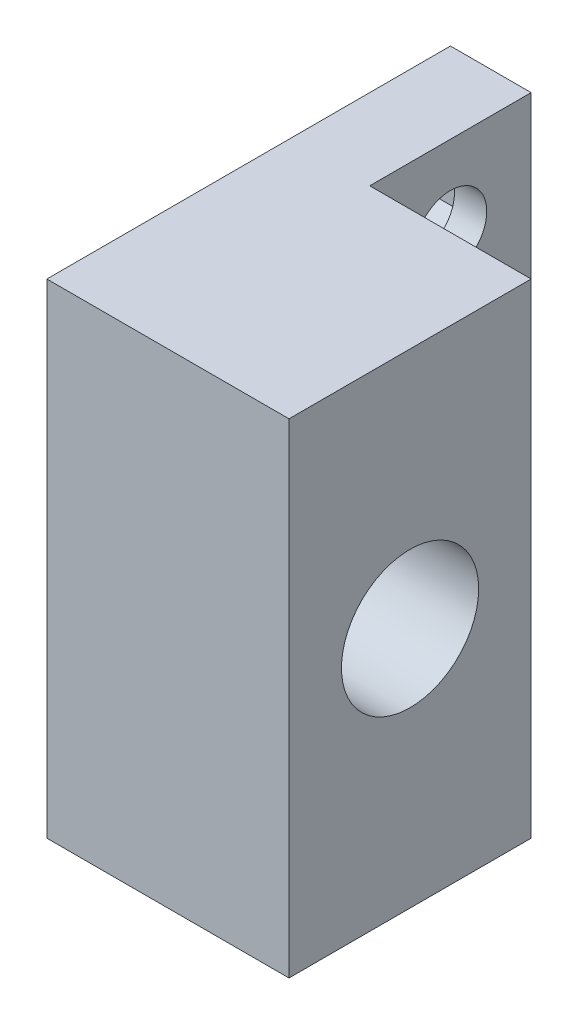
ISO-10303-21;
HEADER;
FILE_DESCRIPTION(('STEP AP214'),'2;1');
FILE_NAME('part.step','',(''),(''),'','','');
FILE_SCHEMA(('AUTOMOTIVE_DESIGN { 1 0 10303 214 1 1 1 1 }'));
ENDSEC;
DATA;
#1=APPLICATION_CONTEXT('core data for automotive mechanical design processes');
#2=APPLICATION_PROTOCOL_DEFINITION('international standard','automotive_design',2000,#1);
#3=PRODUCT_CONTEXT('',#1,'mechanical');
#4=PRODUCT('Part','Part','',(#3));
#5=PRODUCT_RELATED_PRODUCT_CATEGORY('part','',(#4));
#6=PRODUCT_DEFINITION_FORMATION('','',#4);
#7=PRODUCT_DEFINITION_CONTEXT('part definition',#1,'design');
#8=PRODUCT_DEFINITION('design','',#6,#7);
#9=PRODUCT_DEFINITION_SHAPE('','',#8);
#10=(LENGTH_UNIT() NAMED_UNIT(*) SI_UNIT(.MILLI.,.METRE.));
#11=(NAMED_UNIT(*) PLANE_ANGLE_UNIT() SI_UNIT($,.RADIAN.));
#12=(NAMED_UNIT(*) SI_UNIT($,.STERADIAN.) SOLID_ANGLE_UNIT());
#13=UNCERTAINTY_MEASURE_WITH_UNIT(LENGTH_MEASURE(1.E-05),#10,'distance_accuracy_value','');
#14=(GEOMETRIC_REPRESENTATION_CONTEXT(3) GLOBAL_UNCERTAINTY_ASSIGNED_CONTEXT((#13)) GLOBAL_UNIT_ASSIGNED_CONTEXT((#10,
#11,#12)) REPRESENTATION_CONTEXT('',''));
#15=CARTESIAN_POINT('',(0.,0.,0.));
#16=DIRECTION('',(0.,0.,1.));
#17=DIRECTION('',(1.,0.,0.));
#18=AXIS2_PLACEMENT_3D('',#15,#16,#17);
#19=CARTESIAN_POINT('',(-10.,5.,-20.));
#20=DIRECTION('',(1.,0.,0.));
#21=DIRECTION('',(0.,0.,-1.));
#22=AXIS2_PLACEMENT_3D('',#19,#20,#21);
#23=CYLINDRICAL_SURFACE('',#22,2.25);
#24=CARTESIAN_POINT('',(5.,5.,-20.));
#25=DIRECTION('',(1.,0.,0.));
#26=DIRECTION('',(0.,0.,-1.));
#27=AXIS2_PLACEMENT_3D('',#24,#25,#26);
#28=CIRCLE('',#27,2.25);
#29=CARTESIAN_POINT('',(5.,5.,-22.25));
#30=VERTEX_POINT('',#29);
#31=EDGE_CURVE('E286',#30,#30,#28,.T.);
#32=ORIENTED_EDGE('',*,*,#31,.T.);
#33=EDGE_LOOP('',(#32));
#34=FACE_BOUND('',#33,.T.);
#35=CARTESIAN_POINT('',(3.,5.,-20.));
#36=DIRECTION('',(-1.,0.,0.));
#37=DIRECTION('',(0.,0.,1.));
#38=AXIS2_PLACEMENT_3D('',#35,#36,#37);
#39=CIRCLE('',#38,2.25);
#40=CARTESIAN_POINT('',(3.,5.,-17.75));
#41=VERTEX_POINT('',#40);
#42=EDGE_CURVE('E36',#41,#41,#39,.F.);
#43=ORIENTED_EDGE('',*,*,#42,.F.);
#44=EDGE_LOOP('',(#43));
#45=FACE_BOUND('',#44,.T.);
#46=ADVANCED_FACE('F32',(#34,#45),#23,.F.);
#47=CARTESIAN_POINT('',(-10.,25.,-20.));
#48=DIRECTION('',(1.,0.,0.));
#49=DIRECTION('',(0.,0.,-1.));
#50=AXIS2_PLACEMENT_3D('',#47,#48,#49);
#51=CYLINDRICAL_SURFACE('',#50,2.25);
#52=CARTESIAN_POINT('',(5.,25.,-20.));
#53=DIRECTION('',(1.,0.,0.));
#54=DIRECTION('',(0.,0.,-1.));
#55=AXIS2_PLACEMENT_3D('',#52,#53,#54);
#56=CIRCLE('',#55,2.25);
#57=CARTESIAN_POINT('',(5.,25.,-22.25));
#58=VERTEX_POINT('',#57);
#59=EDGE_CURVE('E289',#58,#58,#56,.T.);
#60=ORIENTED_EDGE('',*,*,#59,.T.);
#61=EDGE_LOOP('',(#60));
#62=FACE_BOUND('',#61,.T.);
#63=CARTESIAN_POINT('',(3.,25.,-20.));
#64=DIRECTION('',(-1.,0.,0.));
#65=DIRECTION('',(0.,0.,1.));
#66=AXIS2_PLACEMENT_3D('',#63,#64,#65);
#67=CIRCLE('',#66,2.25);
#68=CARTESIAN_POINT('',(3.,25.,-17.75));
#69=VERTEX_POINT('',#68);
#70=EDGE_CURVE('E276',#69,#69,#67,.F.);
#71=ORIENTED_EDGE('',*,*,#70,.F.);
#72=EDGE_LOOP('',(#71));
#73=FACE_BOUND('',#72,.T.);
#74=ADVANCED_FACE('F370',(#62,#73),#51,.F.);
#75=CARTESIAN_POINT('',(5.,0.,0.));
#76=DIRECTION('',(1.,0.,0.));
#77=DIRECTION('',(0.,0.,-1.));
#78=AXIS2_PLACEMENT_3D('',#75,#76,#77);
#79=PLANE('',#78);
#80=ORIENTED_EDGE('',*,*,#31,.F.);
#81=EDGE_LOOP('',(#80));
#82=FACE_BOUND('',#81,.T.);
#83=DIRECTION('',(0.,1.,0.));
#84=VECTOR('',#83,1.);
#85=CARTESIAN_POINT('',(5.,30.,-15.));
#86=LINE('',#85,#84);
#87=CARTESIAN_POINT('',(5.,0.,-15.));
#88=VERTEX_POINT('',#87);
#89=CARTESIAN_POINT('',(5.,10.,-15.));
#90=VERTEX_POINT('',#89);
#91=EDGE_CURVE('E43',#88,#90,#86,.T.);
#92=ORIENTED_EDGE('',*,*,#91,.F.);
#93=DIRECTION('',(0.,0.,-1.));
#94=VECTOR('',#93,1.);
#95=CARTESIAN_POINT('',(5.,0.,0.));
#96=LINE('',#95,#94);
#97=CARTESIAN_POINT('',(5.,0.,-25.));
#98=VERTEX_POINT('',#97);
#99=EDGE_CURVE('E325',#88,#98,#96,.T.);
#100=ORIENTED_EDGE('',*,*,#99,.T.);
#101=DIRECTION('',(0.,1.,0.));
#102=VECTOR('',#101,1.);
#103=CARTESIAN_POINT('',(5.,0.,-25.));
#104=LINE('',#103,#102);
#105=CARTESIAN_POINT('',(5.,10.,-25.));
#106=VERTEX_POINT('',#105);
#107=EDGE_CURVE('E323',#98,#106,#104,.T.);
#108=ORIENTED_EDGE('',*,*,#107,.T.);
#109=DIRECTION('',(0.,0.,1.));
#110=VECTOR('',#109,1.);
#111=CARTESIAN_POINT('',(5.,9.99999999999999,0.));
#112=LINE('',#111,#110);
#113=EDGE_CURVE('E327',#106,#90,#112,.T.);
#114=ORIENTED_EDGE('',*,*,#113,.T.);
#115=EDGE_LOOP('',(#92,#100,#108,#114));
#116=FACE_BOUND('',#115,.T.);
#117=ADVANCED_FACE('F372',(#82,#116),#79,.T.);
#118=CARTESIAN_POINT('',(5.,0.,-15.));
#119=DIRECTION('',(0.,0.,1.));
#120=DIRECTION('',(1.,0.,0.));
#121=AXIS2_PLACEMENT_3D('',#118,#119,#120);
#122=PLANE('',#121);
#123=DIRECTION('',(0.,1.,0.));
#124=VECTOR('',#123,1.);
#125=CARTESIAN_POINT('',(0.,0.,-15.));
#126=LINE('',#125,#124);
#127=CARTESIAN_POINT('',(0.,10.,-15.));
#128=VERTEX_POINT('',#127);
#129=CARTESIAN_POINT('',(0.,20.,-15.));
#130=VERTEX_POINT('',#129);
#131=EDGE_CURVE('E315',#128,#130,#126,.T.);
#132=ORIENTED_EDGE('',*,*,#131,.T.);
#133=DIRECTION('',(-1.,0.,0.));
#134=VECTOR('',#133,1.);
#135=CARTESIAN_POINT('',(5.,20.,-15.));
#136=LINE('',#135,#134);
#137=CARTESIAN_POINT('',(5.,20.,-15.));
#138=VERTEX_POINT('',#137);
#139=EDGE_CURVE('E41',#138,#130,#136,.T.);
#140=ORIENTED_EDGE('',*,*,#139,.F.);
#141=CARTESIAN_POINT('',(5.,30.,-15.));
#142=VERTEX_POINT('',#141);
#143=EDGE_CURVE('E11',#138,#142,#86,.T.);
#144=ORIENTED_EDGE('',*,*,#143,.T.);
#145=DIRECTION('',(-1.,0.,0.));
#146=VECTOR('',#145,1.);
#147=CARTESIAN_POINT('',(15.,30.,-15.));
#148=LINE('',#147,#146);
#149=CARTESIAN_POINT('',(15.,30.,-15.));
#150=VERTEX_POINT('',#149);
#151=EDGE_CURVE('E307',#150,#142,#148,.T.);
#152=ORIENTED_EDGE('',*,*,#151,.F.);
#153=DIRECTION('',(0.,1.,0.));
#154=VECTOR('',#153,1.);
#155=CARTESIAN_POINT('',(15.,30.,-15.));
#156=LINE('',#155,#154);
#157=CARTESIAN_POINT('',(15.,0.,-15.));
#158=VERTEX_POINT('',#157);
#159=EDGE_CURVE('E303',#158,#150,#156,.T.);
#160=ORIENTED_EDGE('',*,*,#159,.F.);
#161=DIRECTION('',(-1.,0.,0.));
#162=VECTOR('',#161,1.);
#163=CARTESIAN_POINT('',(15.,0.,-15.));
#164=LINE('',#163,#162);
#165=EDGE_CURVE('E312',#158,#88,#164,.T.);
#166=ORIENTED_EDGE('',*,*,#165,.T.);
#167=ORIENTED_EDGE('',*,*,#91,.T.);
#168=DIRECTION('',(-1.,0.,0.));
#169=VECTOR('',#168,1.);
#170=CARTESIAN_POINT('',(5.,10.,-15.));
#171=LINE('',#170,#169);
#172=EDGE_CURVE('E329',#90,#128,#171,.T.);
#173=ORIENTED_EDGE('',*,*,#172,.T.);
#174=EDGE_LOOP('',(#132,#140,#144,#152,#160,#166,#167,#173));
#175=FACE_BOUND('',#174,.T.);
#176=ADVANCED_FACE('F34',(#175),#122,.F.);
#177=CARTESIAN_POINT('',(5.,20.,0.));
#178=DIRECTION('',(0.,1.,0.));
#179=DIRECTION('',(0.,0.,1.));
#180=AXIS2_PLACEMENT_3D('',#177,#178,#179);
#181=PLANE('',#180);
#182=DIRECTION('',(0.,0.,-1.));
#183=VECTOR('',#182,1.);
#184=CARTESIAN_POINT('',(0.,20.,0.));
#185=LINE('',#184,#183);
#186=CARTESIAN_POINT('',(0.,20.,-25.));
#187=VERTEX_POINT('',#186);
#188=EDGE_CURVE('E332',#130,#187,#185,.T.);
#189=ORIENTED_EDGE('',*,*,#188,.T.);
#190=DIRECTION('',(-1.,0.,0.));
#191=VECTOR('',#190,1.);
#192=CARTESIAN_POINT('',(5.,20.,-25.));
#193=LINE('',#192,#191);
#194=CARTESIAN_POINT('',(5.,20.,-25.));
#195=VERTEX_POINT('',#194);
#196=EDGE_CURVE('E361',#195,#187,#193,.T.);
#197=ORIENTED_EDGE('',*,*,#196,.F.);
#198=DIRECTION('',(0.,0.,-1.));
#199=VECTOR('',#198,1.);
#200=CARTESIAN_POINT('',(5.,20.,0.));
#201=LINE('',#200,#199);
#202=EDGE_CURVE('E316',#138,#195,#201,.T.);
#203=ORIENTED_EDGE('',*,*,#202,.F.);
#204=ORIENTED_EDGE('',*,*,#139,.T.);
#205=EDGE_LOOP('',(#189,#197,#203,#204));
#206=FACE_BOUND('',#205,.T.);
#207=ADVANCED_FACE('F420',(#206),#181,.F.);
#208=CARTESIAN_POINT('',(5.,0.,-25.));
#209=DIRECTION('',(0.,0.,1.));
#210=DIRECTION('',(1.,0.,0.));
#211=AXIS2_PLACEMENT_3D('',#208,#209,#210);
#212=PLANE('',#211);
#213=DIRECTION('',(0.,1.,0.));
#214=VECTOR('',#213,1.);
#215=CARTESIAN_POINT('',(0.,0.,-25.));
#216=LINE('',#215,#214);
#217=CARTESIAN_POINT('',(0.,30.,-25.));
#218=VERTEX_POINT('',#217);
#219=EDGE_CURVE('E334',#187,#218,#216,.T.);
#220=ORIENTED_EDGE('',*,*,#219,.T.);
#221=DIRECTION('',(-1.,0.,0.));
#222=VECTOR('',#221,1.);
#223=CARTESIAN_POINT('',(5.,30.,-25.));
#224=LINE('',#223,#222);
#225=CARTESIAN_POINT('',(5.,30.,-25.));
#226=VERTEX_POINT('',#225);
#227=EDGE_CURVE('E359',#226,#218,#224,.T.);
#228=ORIENTED_EDGE('',*,*,#227,.F.);
#229=EDGE_CURVE('E318',#195,#226,#104,.T.);
#230=ORIENTED_EDGE('',*,*,#229,.F.);
#231=ORIENTED_EDGE('',*,*,#196,.T.);
#232=EDGE_LOOP('',(#220,#228,#230,#231));
#233=FACE_BOUND('',#232,.T.);
#234=ADVANCED_FACE('F409',(#233),#212,.F.);
#235=CARTESIAN_POINT('',(5.,30.,0.));
#236=DIRECTION('',(0.,1.,0.));
#237=DIRECTION('',(0.,0.,1.));
#238=AXIS2_PLACEMENT_3D('',#235,#236,#237);
#239=PLANE('',#238);
#240=DIRECTION('',(0.,0.,-1.));
#241=VECTOR('',#240,1.);
#242=CARTESIAN_POINT('',(0.,30.,0.));
#243=LINE('',#242,#241);
#244=CARTESIAN_POINT('',(0.,30.,0.));
#245=VERTEX_POINT('',#244);
#246=EDGE_CURVE('E337',#245,#218,#243,.T.);
#247=ORIENTED_EDGE('',*,*,#246,.F.);
#248=DIRECTION('',(-1.,0.,0.));
#249=VECTOR('',#248,1.);
#250=CARTESIAN_POINT('',(5.,30.,0.));
#251=LINE('',#250,#249);
#252=CARTESIAN_POINT('',(15.,30.,0.));
#253=VERTEX_POINT('',#252);
#254=EDGE_CURVE('E357',#253,#245,#251,.T.);
#255=ORIENTED_EDGE('',*,*,#254,.F.);
#256=DIRECTION('',(0.,0.,1.));
#257=VECTOR('',#256,1.);
#258=CARTESIAN_POINT('',(15.,30.,0.));
#259=LINE('',#258,#257);
#260=EDGE_CURVE('E305',#150,#253,#259,.T.);
#261=ORIENTED_EDGE('',*,*,#260,.F.);
#262=ORIENTED_EDGE('',*,*,#151,.T.);
#263=DIRECTION('',(0.,0.,-1.));
#264=VECTOR('',#263,1.);
#265=CARTESIAN_POINT('',(5.,30.,0.));
#266=LINE('',#265,#264);
#267=EDGE_CURVE('E322',#142,#226,#266,.T.);
#268=ORIENTED_EDGE('',*,*,#267,.T.);
#269=ORIENTED_EDGE('',*,*,#227,.T.);
#270=EDGE_LOOP('',(#247,#255,#261,#262,#268,#269));
#271=FACE_BOUND('',#270,.T.);
#272=ADVANCED_FACE('F416',(#271),#239,.T.);
#273=CARTESIAN_POINT('',(5.,0.,0.));
#274=DIRECTION('',(0.,0.,1.));
#275=DIRECTION('',(1.,0.,0.));
#276=AXIS2_PLACEMENT_3D('',#273,#274,#275);
#277=PLANE('',#276);
#278=DIRECTION('',(0.,1.,0.));
#279=VECTOR('',#278,1.);
#280=CARTESIAN_POINT('',(0.,0.,0.));
#281=LINE('',#280,#279);
#282=CARTESIAN_POINT('',(0.,0.,0.));
#283=VERTEX_POINT('',#282);
#284=EDGE_CURVE('E341',#283,#245,#281,.T.);
#285=ORIENTED_EDGE('',*,*,#284,.F.);
#286=DIRECTION('',(-1.,0.,0.));
#287=VECTOR('',#286,1.);
#288=CARTESIAN_POINT('',(5.,0.,0.));
#289=LINE('',#288,#287);
#290=CARTESIAN_POINT('',(15.,0.,0.));
#291=VERTEX_POINT('',#290);
#292=EDGE_CURVE('E355',#291,#283,#289,.T.);
#293=ORIENTED_EDGE('',*,*,#292,.F.);
#294=DIRECTION('',(0.,-1.,0.));
#295=VECTOR('',#294,1.);
#296=CARTESIAN_POINT('',(15.,30.,0.));
#297=LINE('',#296,#295);
#298=EDGE_CURVE('E298',#253,#291,#297,.T.);
#299=ORIENTED_EDGE('',*,*,#298,.F.);
#300=ORIENTED_EDGE('',*,*,#254,.T.);
#301=EDGE_LOOP('',(#285,#293,#299,#300));
#302=FACE_BOUND('',#301,.T.);
#303=ADVANCED_FACE('F412',(#302),#277,.T.);
#304=CARTESIAN_POINT('',(5.,0.,0.));
#305=DIRECTION('',(0.,1.,0.));
#306=DIRECTION('',(0.,0.,1.));
#307=AXIS2_PLACEMENT_3D('',#304,#305,#306);
#308=PLANE('',#307);
#309=DIRECTION('',(0.,0.,-1.));
#310=VECTOR('',#309,1.);
#311=CARTESIAN_POINT('',(0.,0.,0.));
#312=LINE('',#311,#310);
#313=CARTESIAN_POINT('',(0.,0.,-25.));
#314=VERTEX_POINT('',#313);
#315=EDGE_CURVE('E344',#283,#314,#312,.T.);
#316=ORIENTED_EDGE('',*,*,#315,.T.);
#317=DIRECTION('',(-1.,0.,0.));
#318=VECTOR('',#317,1.);
#319=CARTESIAN_POINT('',(5.,0.,-25.));
#320=LINE('',#319,#318);
#321=EDGE_CURVE('E352',#98,#314,#320,.T.);
#322=ORIENTED_EDGE('',*,*,#321,.F.);
#323=ORIENTED_EDGE('',*,*,#99,.F.);
#324=ORIENTED_EDGE('',*,*,#165,.F.);
#325=DIRECTION('',(0.,0.,-1.));
#326=VECTOR('',#325,1.);
#327=CARTESIAN_POINT('',(15.,0.,0.));
#328=LINE('',#327,#326);
#329=EDGE_CURVE('E301',#291,#158,#328,.T.);
#330=ORIENTED_EDGE('',*,*,#329,.F.);
#331=ORIENTED_EDGE('',*,*,#292,.T.);
#332=EDGE_LOOP('',(#316,#322,#323,#324,#330,#331));
#333=FACE_BOUND('',#332,.T.);
#334=ADVANCED_FACE('F407',(#333),#308,.F.);
#335=CARTESIAN_POINT('',(0.,10.,-25.));
#336=VERTEX_POINT('',#335);
#337=EDGE_CURVE('E338',#314,#336,#216,.T.);
#338=ORIENTED_EDGE('',*,*,#337,.T.);
#339=DIRECTION('',(-1.,0.,0.));
#340=VECTOR('',#339,1.);
#341=CARTESIAN_POINT('',(5.,10.,-25.));
#342=LINE('',#341,#340);
#343=EDGE_CURVE('E349',#106,#336,#342,.T.);
#344=ORIENTED_EDGE('',*,*,#343,.F.);
#345=ORIENTED_EDGE('',*,*,#107,.F.);
#346=ORIENTED_EDGE('',*,*,#321,.T.);
#347=EDGE_LOOP('',(#338,#344,#345,#346));
#348=FACE_BOUND('',#347,.T.);
#349=ADVANCED_FACE('F403',(#348),#212,.F.);
#350=CARTESIAN_POINT('',(5.,9.99999999999999,0.));
#351=DIRECTION('',(0.,-1.,0.));
#352=DIRECTION('',(0.,0.,-1.));
#353=AXIS2_PLACEMENT_3D('',#350,#351,#352);
#354=PLANE('',#353);
#355=DIRECTION('',(0.,0.,1.));
#356=VECTOR('',#355,1.);
#357=CARTESIAN_POINT('',(0.,9.99999999999999,0.));
#358=LINE('',#357,#356);
#359=EDGE_CURVE('E319',#336,#128,#358,.T.);
#360=ORIENTED_EDGE('',*,*,#359,.T.);
#361=ORIENTED_EDGE('',*,*,#172,.F.);
#362=ORIENTED_EDGE('',*,*,#113,.F.);
#363=ORIENTED_EDGE('',*,*,#343,.T.);
#364=EDGE_LOOP('',(#360,#361,#362,#363));
#365=FACE_BOUND('',#364,.T.);
#366=ADVANCED_FACE('F396',(#365),#354,.F.);
#367=ORIENTED_EDGE('',*,*,#59,.F.);
#368=EDGE_LOOP('',(#367));
#369=FACE_BOUND('',#368,.T.);
#370=ORIENTED_EDGE('',*,*,#143,.F.);
#371=ORIENTED_EDGE('',*,*,#202,.T.);
#372=ORIENTED_EDGE('',*,*,#229,.T.);
#373=ORIENTED_EDGE('',*,*,#267,.F.);
#374=EDGE_LOOP('',(#370,#371,#372,#373));
#375=FACE_BOUND('',#374,.T.);
#376=ADVANCED_FACE('F381',(#369,#375),#79,.T.);
#377=CARTESIAN_POINT('',(0.,0.,0.));
#378=DIRECTION('',(1.,0.,0.));
#379=DIRECTION('',(0.,0.,-1.));
#380=AXIS2_PLACEMENT_3D('',#377,#378,#379);
#381=PLANE('',#380);
#382=DIRECTION('',(0.,-0.500000000000001,-0.866025403784438));
#383=VECTOR('',#382,1.);
#384=CARTESIAN_POINT('',(0.,9.00000000000001,-20.));
#385=LINE('',#384,#383);
#386=CARTESIAN_POINT('',(0.,9.00000000000001,-20.));
#387=VERTEX_POINT('',#386);
#388=CARTESIAN_POINT('',(0.,7.,-23.4641016151378));
#389=VERTEX_POINT('',#388);
#390=EDGE_CURVE('E220',#387,#389,#385,.T.);
#391=ORIENTED_EDGE('',*,*,#390,.F.);
#392=DIRECTION('',(0.,0.5,-0.866025403784439));
#393=VECTOR('',#392,1.);
#394=CARTESIAN_POINT('',(0.,7.,-16.5358983848623));
#395=LINE('',#394,#393);
#396=CARTESIAN_POINT('',(0.,7.,-16.5358983848623));
#397=VERTEX_POINT('',#396);
#398=EDGE_CURVE('E50',#397,#387,#395,.T.);
#399=ORIENTED_EDGE('',*,*,#398,.F.);
#400=DIRECTION('',(0.,1.,0.));
#401=VECTOR('',#400,1.);
#402=CARTESIAN_POINT('',(0.,3.,-16.5358983848623));
#403=LINE('',#402,#401);
#404=CARTESIAN_POINT('',(0.,3.,-16.5358983848623));
#405=VERTEX_POINT('',#404);
#406=EDGE_CURVE('E206',#405,#397,#403,.T.);
#407=ORIENTED_EDGE('',*,*,#406,.F.);
#408=DIRECTION('',(0.,0.5,0.866025403784439));
#409=VECTOR('',#408,1.);
#410=CARTESIAN_POINT('',(0.,1.,-20.));
#411=LINE('',#410,#409);
#412=CARTESIAN_POINT('',(0.,1.,-20.));
#413=VERTEX_POINT('',#412);
#414=EDGE_CURVE('E209',#413,#405,#411,.T.);
#415=ORIENTED_EDGE('',*,*,#414,.F.);
#416=DIRECTION('',(0.,-0.5,0.866025403784438));
#417=VECTOR('',#416,1.);
#418=CARTESIAN_POINT('',(0.,3.,-23.4641016151378));
#419=LINE('',#418,#417);
#420=CARTESIAN_POINT('',(0.,3.,-23.4641016151378));
#421=VERTEX_POINT('',#420);
#422=EDGE_CURVE('E225',#421,#413,#419,.T.);
#423=ORIENTED_EDGE('',*,*,#422,.F.);
#424=DIRECTION('',(0.,-1.,0.));
#425=VECTOR('',#424,1.);
#426=CARTESIAN_POINT('',(0.,7.,-23.4641016151378));
#427=LINE('',#426,#425);
#428=EDGE_CURVE('E222',#389,#421,#427,.T.);
#429=ORIENTED_EDGE('',*,*,#428,.F.);
#430=EDGE_LOOP('',(#391,#399,#407,#415,#423,#429));
#431=FACE_BOUND('',#430,.T.);
#432=DIRECTION('',(0.,-0.5,-0.866025403784438));
#433=VECTOR('',#432,1.);
#434=CARTESIAN_POINT('',(0.,29.,-20.));
#435=LINE('',#434,#433);
#436=CARTESIAN_POINT('',(0.,29.,-20.));
#437=VERTEX_POINT('',#436);
#438=CARTESIAN_POINT('',(0.,27.,-23.4641016151378));
#439=VERTEX_POINT('',#438);
#440=EDGE_CURVE('E260',#437,#439,#435,.T.);
#441=ORIENTED_EDGE('',*,*,#440,.F.);
#442=DIRECTION('',(0.,0.500000000000001,-0.866025403784438));
#443=VECTOR('',#442,1.);
#444=CARTESIAN_POINT('',(0.,27.,-16.5358983848623));
#445=LINE('',#444,#443);
#446=CARTESIAN_POINT('',(0.,27.,-16.5358983848623));
#447=VERTEX_POINT('',#446);
#448=EDGE_CURVE('E58',#447,#437,#445,.T.);
#449=ORIENTED_EDGE('',*,*,#448,.F.);
#450=DIRECTION('',(0.,1.,0.));
#451=VECTOR('',#450,1.);
#452=CARTESIAN_POINT('',(0.,23.,-16.5358983848623));
#453=LINE('',#452,#451);
#454=CARTESIAN_POINT('',(0.,23.,-16.5358983848623));
#455=VERTEX_POINT('',#454);
#456=EDGE_CURVE('E243',#455,#447,#453,.T.);
#457=ORIENTED_EDGE('',*,*,#456,.F.);
#458=DIRECTION('',(0.,0.5,0.866025403784438));
#459=VECTOR('',#458,1.);
#460=CARTESIAN_POINT('',(0.,21.,-20.));
#461=LINE('',#460,#459);
#462=CARTESIAN_POINT('',(0.,21.,-20.));
#463=VERTEX_POINT('',#462);
#464=EDGE_CURVE('E269',#463,#455,#461,.T.);
#465=ORIENTED_EDGE('',*,*,#464,.F.);
#466=DIRECTION('',(0.,-0.5,0.866025403784439));
#467=VECTOR('',#466,1.);
#468=CARTESIAN_POINT('',(0.,23.,-23.4641016151378));
#469=LINE('',#468,#467);
#470=CARTESIAN_POINT('',(0.,23.,-23.4641016151378));
#471=VERTEX_POINT('',#470);
#472=EDGE_CURVE('E266',#471,#463,#469,.T.);
#473=ORIENTED_EDGE('',*,*,#472,.F.);
#474=DIRECTION('',(0.,-1.,0.));
#475=VECTOR('',#474,1.);
#476=CARTESIAN_POINT('',(0.,27.,-23.4641016151378));
#477=LINE('',#476,#475);
#478=EDGE_CURVE('E263',#439,#471,#477,.T.);
#479=ORIENTED_EDGE('',*,*,#478,.F.);
#480=EDGE_LOOP('',(#441,#449,#457,#465,#473,#479));
#481=FACE_BOUND('',#480,.T.);
#482=CARTESIAN_POINT('',(0.,15.,-7.5));
#483=DIRECTION('',(1.,0.,0.));
#484=DIRECTION('',(0.,0.,-1.));
#485=AXIS2_PLACEMENT_3D('',#482,#483,#484);
#486=CIRCLE('',#485,4.25);
#487=CARTESIAN_POINT('',(0.,15.,-11.75));
#488=VERTEX_POINT('',#487);
#489=EDGE_CURVE('E293',#488,#488,#486,.T.);
#490=ORIENTED_EDGE('',*,*,#489,.T.);
#491=EDGE_LOOP('',(#490));
#492=FACE_BOUND('',#491,.T.);
#493=ORIENTED_EDGE('',*,*,#131,.F.);
#494=ORIENTED_EDGE('',*,*,#359,.F.);
#495=ORIENTED_EDGE('',*,*,#337,.F.);
#496=ORIENTED_EDGE('',*,*,#315,.F.);
#497=ORIENTED_EDGE('',*,*,#284,.T.);
#498=ORIENTED_EDGE('',*,*,#246,.T.);
#499=ORIENTED_EDGE('',*,*,#219,.F.);
#500=ORIENTED_EDGE('',*,*,#188,.F.);
#501=EDGE_LOOP('',(#493,#494,#495,#496,#497,#498,#499,#500));
#502=FACE_BOUND('',#501,.T.);
#503=ADVANCED_FACE('F392',(#431,#481,#492,#502),#381,.F.);
#504=CARTESIAN_POINT('',(15.,0.,0.));
#505=DIRECTION('',(1.,0.,0.));
#506=DIRECTION('',(0.,0.,-1.));
#507=AXIS2_PLACEMENT_3D('',#504,#505,#506);
#508=PLANE('',#507);
#509=CARTESIAN_POINT('',(15.,15.,-7.5));
#510=DIRECTION('',(1.,0.,0.));
#511=DIRECTION('',(0.,0.,-1.));
#512=AXIS2_PLACEMENT_3D('',#509,#510,#511);
#513=CIRCLE('',#512,4.25);
#514=CARTESIAN_POINT('',(15.,15.,-11.75));
#515=VERTEX_POINT('',#514);
#516=EDGE_CURVE('E292',#515,#515,#513,.T.);
#517=ORIENTED_EDGE('',*,*,#516,.F.);
#518=EDGE_LOOP('',(#517));
#519=FACE_BOUND('',#518,.T.);
#520=ORIENTED_EDGE('',*,*,#298,.T.);
#521=ORIENTED_EDGE('',*,*,#329,.T.);
#522=ORIENTED_EDGE('',*,*,#159,.T.);
#523=ORIENTED_EDGE('',*,*,#260,.T.);
#524=EDGE_LOOP('',(#520,#521,#522,#523));
#525=FACE_BOUND('',#524,.T.);
#526=ADVANCED_FACE('F389',(#519,#525),#508,.T.);
#527=CARTESIAN_POINT('',(0.,15.,-7.5));
#528=DIRECTION('',(1.,0.,0.));
#529=DIRECTION('',(0.,0.,-1.));
#530=AXIS2_PLACEMENT_3D('',#527,#528,#529);
#531=CYLINDRICAL_SURFACE('',#530,4.25);
#532=ORIENTED_EDGE('',*,*,#489,.F.);
#533=EDGE_LOOP('',(#532));
#534=FACE_BOUND('',#533,.T.);
#535=ORIENTED_EDGE('',*,*,#516,.T.);
#536=EDGE_LOOP('',(#535));
#537=FACE_BOUND('',#536,.T.);
#538=ADVANCED_FACE('F386',(#534,#537),#531,.F.);
#539=CARTESIAN_POINT('',(3.,0.,0.));
#540=DIRECTION('',(-1.,0.,0.));
#541=DIRECTION('',(0.,0.,1.));
#542=AXIS2_PLACEMENT_3D('',#539,#540,#541);
#543=PLANE('',#542);
#544=DIRECTION('',(0.,0.500000000000001,-0.866025403784438));
#545=VECTOR('',#544,1.);
#546=CARTESIAN_POINT('',(3.,27.,-16.5358983848623));
#547=LINE('',#546,#545);
#548=CARTESIAN_POINT('',(3.,27.,-16.5358983848623));
#549=VERTEX_POINT('',#548);
#550=CARTESIAN_POINT('',(3.,29.,-20.));
#551=VERTEX_POINT('',#550);
#552=EDGE_CURVE('E239',#549,#551,#547,.T.);
#553=ORIENTED_EDGE('',*,*,#552,.T.);
#554=DIRECTION('',(0.,-0.5,-0.866025403784438));
#555=VECTOR('',#554,1.);
#556=CARTESIAN_POINT('',(3.,29.,-20.));
#557=LINE('',#556,#555);
#558=CARTESIAN_POINT('',(3.,27.,-23.4641016151378));
#559=VERTEX_POINT('',#558);
#560=EDGE_CURVE('E242',#551,#559,#557,.T.);
#561=ORIENTED_EDGE('',*,*,#560,.T.);
#562=DIRECTION('',(0.,-1.,0.));
#563=VECTOR('',#562,1.);
#564=CARTESIAN_POINT('',(3.,27.,-23.4641016151378));
#565=LINE('',#564,#563);
#566=CARTESIAN_POINT('',(3.,23.,-23.4641016151378));
#567=VERTEX_POINT('',#566);
#568=EDGE_CURVE('E246',#559,#567,#565,.T.);
#569=ORIENTED_EDGE('',*,*,#568,.T.);
#570=DIRECTION('',(0.,-0.5,0.866025403784439));
#571=VECTOR('',#570,1.);
#572=CARTESIAN_POINT('',(3.,23.,-23.4641016151378));
#573=LINE('',#572,#571);
#574=CARTESIAN_POINT('',(3.,21.,-20.));
#575=VERTEX_POINT('',#574);
#576=EDGE_CURVE('E249',#567,#575,#573,.T.);
#577=ORIENTED_EDGE('',*,*,#576,.T.);
#578=DIRECTION('',(0.,0.5,0.866025403784438));
#579=VECTOR('',#578,1.);
#580=CARTESIAN_POINT('',(3.,21.,-20.));
#581=LINE('',#580,#579);
#582=CARTESIAN_POINT('',(3.,23.,-16.5358983848623));
#583=VERTEX_POINT('',#582);
#584=EDGE_CURVE('E252',#575,#583,#581,.T.);
#585=ORIENTED_EDGE('',*,*,#584,.T.);
#586=DIRECTION('',(0.,1.,0.));
#587=VECTOR('',#586,1.);
#588=CARTESIAN_POINT('',(3.,23.,-16.5358983848623));
#589=LINE('',#588,#587);
#590=EDGE_CURVE('E255',#583,#549,#589,.T.);
#591=ORIENTED_EDGE('',*,*,#590,.T.);
#592=EDGE_LOOP('',(#553,#561,#569,#577,#585,#591));
#593=FACE_BOUND('',#592,.T.);
#594=ORIENTED_EDGE('',*,*,#70,.T.);
#595=EDGE_LOOP('',(#594));
#596=FACE_BOUND('',#595,.T.);
#597=ADVANCED_FACE('F368',(#593,#596),#543,.T.);
#598=CARTESIAN_POINT('',(3.,27.,-16.5358983848623));
#599=DIRECTION('',(0.,0.866025403784438,0.500000000000001));
#600=DIRECTION('',(0.,-0.500000000000001,0.866025403784438));
#601=AXIS2_PLACEMENT_3D('',#598,#599,#600);
#602=PLANE('',#601);
#603=ORIENTED_EDGE('',*,*,#448,.T.);
#604=DIRECTION('',(-1.,0.,0.));
#605=VECTOR('',#604,1.);
#606=CARTESIAN_POINT('',(3.,29.,-20.));
#607=LINE('',#606,#605);
#608=EDGE_CURVE('E258',#551,#437,#607,.T.);
#609=ORIENTED_EDGE('',*,*,#608,.F.);
#610=ORIENTED_EDGE('',*,*,#552,.F.);
#611=DIRECTION('',(-1.,0.,0.));
#612=VECTOR('',#611,1.);
#613=CARTESIAN_POINT('',(3.,27.,-16.5358983848623));
#614=LINE('',#613,#612);
#615=EDGE_CURVE('E274',#549,#447,#614,.T.);
#616=ORIENTED_EDGE('',*,*,#615,.T.);
#617=EDGE_LOOP('',(#603,#609,#610,#616));
#618=FACE_BOUND('',#617,.T.);
#619=ADVANCED_FACE('F500',(#618),#602,.F.);
#620=CARTESIAN_POINT('',(3.,23.,-16.5358983848623));
#621=DIRECTION('',(0.,0.,1.));
#622=DIRECTION('',(1.,0.,0.));
#623=AXIS2_PLACEMENT_3D('',#620,#621,#622);
#624=PLANE('',#623);
#625=ORIENTED_EDGE('',*,*,#456,.T.);
#626=ORIENTED_EDGE('',*,*,#615,.F.);
#627=ORIENTED_EDGE('',*,*,#590,.F.);
#628=DIRECTION('',(-1.,0.,0.));
#629=VECTOR('',#628,1.);
#630=CARTESIAN_POINT('',(3.,23.,-16.5358983848623));
#631=LINE('',#630,#629);
#632=EDGE_CURVE('E277',#583,#455,#631,.T.);
#633=ORIENTED_EDGE('',*,*,#632,.T.);
#634=EDGE_LOOP('',(#625,#626,#627,#633));
#635=FACE_BOUND('',#634,.T.);
#636=ADVANCED_FACE('F510',(#635),#624,.F.);
#637=CARTESIAN_POINT('',(3.,21.,-20.));
#638=DIRECTION('',(0.,-0.866025403784439,0.5));
#639=DIRECTION('',(0.,-0.5,-0.866025403784439));
#640=AXIS2_PLACEMENT_3D('',#637,#638,#639);
#641=PLANE('',#640);
#642=ORIENTED_EDGE('',*,*,#464,.T.);
#643=ORIENTED_EDGE('',*,*,#632,.F.);
#644=ORIENTED_EDGE('',*,*,#584,.F.);
#645=DIRECTION('',(-1.,0.,0.));
#646=VECTOR('',#645,1.);
#647=CARTESIAN_POINT('',(3.,21.,-20.));
#648=LINE('',#647,#646);
#649=EDGE_CURVE('E279',#575,#463,#648,.T.);
#650=ORIENTED_EDGE('',*,*,#649,.T.);
#651=EDGE_LOOP('',(#642,#643,#644,#650));
#652=FACE_BOUND('',#651,.T.);
#653=ADVANCED_FACE('F518',(#652),#641,.F.);
#654=CARTESIAN_POINT('',(3.,23.,-23.4641016151378));
#655=DIRECTION('',(0.,-0.866025403784439,-0.5));
#656=DIRECTION('',(0.,0.5,-0.866025403784439));
#657=AXIS2_PLACEMENT_3D('',#654,#655,#656);
#658=PLANE('',#657);
#659=ORIENTED_EDGE('',*,*,#472,.T.);
#660=ORIENTED_EDGE('',*,*,#649,.F.);
#661=ORIENTED_EDGE('',*,*,#576,.F.);
#662=DIRECTION('',(-1.,0.,0.));
#663=VECTOR('',#662,1.);
#664=CARTESIAN_POINT('',(3.,23.,-23.4641016151378));
#665=LINE('',#664,#663);
#666=EDGE_CURVE('E281',#567,#471,#665,.T.);
#667=ORIENTED_EDGE('',*,*,#666,.T.);
#668=EDGE_LOOP('',(#659,#660,#661,#667));
#669=FACE_BOUND('',#668,.T.);
#670=ADVANCED_FACE('F528',(#669),#658,.F.);
#671=CARTESIAN_POINT('',(3.,27.,-23.4641016151378));
#672=DIRECTION('',(0.,0.,-1.));
#673=DIRECTION('',(-1.,0.,0.));
#674=AXIS2_PLACEMENT_3D('',#671,#672,#673);
#675=PLANE('',#674);
#676=ORIENTED_EDGE('',*,*,#478,.T.);
#677=ORIENTED_EDGE('',*,*,#666,.F.);
#678=ORIENTED_EDGE('',*,*,#568,.F.);
#679=DIRECTION('',(-1.,0.,0.));
#680=VECTOR('',#679,1.);
#681=CARTESIAN_POINT('',(3.,27.,-23.4641016151378));
#682=LINE('',#681,#680);
#683=EDGE_CURVE('E283',#559,#439,#682,.T.);
#684=ORIENTED_EDGE('',*,*,#683,.T.);
#685=EDGE_LOOP('',(#676,#677,#678,#684));
#686=FACE_BOUND('',#685,.T.);
#687=ADVANCED_FACE('F538',(#686),#675,.F.);
#688=CARTESIAN_POINT('',(3.,29.,-20.));
#689=DIRECTION('',(0.,0.866025403784438,-0.5));
#690=DIRECTION('',(0.,0.5,0.866025403784438));
#691=AXIS2_PLACEMENT_3D('',#688,#689,#690);
#692=PLANE('',#691);
#693=ORIENTED_EDGE('',*,*,#440,.T.);
#694=ORIENTED_EDGE('',*,*,#683,.F.);
#695=ORIENTED_EDGE('',*,*,#560,.F.);
#696=ORIENTED_EDGE('',*,*,#608,.T.);
#697=EDGE_LOOP('',(#693,#694,#695,#696));
#698=FACE_BOUND('',#697,.T.);
#699=ADVANCED_FACE('F548',(#698),#692,.F.);
#700=CARTESIAN_POINT('',(3.,0.,0.));
#701=DIRECTION('',(-1.,0.,0.));
#702=DIRECTION('',(0.,0.,1.));
#703=AXIS2_PLACEMENT_3D('',#700,#701,#702);
#704=PLANE('',#703);
#705=DIRECTION('',(0.,0.5,-0.866025403784439));
#706=VECTOR('',#705,1.);
#707=CARTESIAN_POINT('',(3.,7.,-16.5358983848623));
#708=LINE('',#707,#706);
#709=CARTESIAN_POINT('',(3.,7.,-16.5358983848623));
#710=VERTEX_POINT('',#709);
#711=CARTESIAN_POINT('',(3.,9.00000000000001,-20.));
#712=VERTEX_POINT('',#711);
#713=EDGE_CURVE('E186',#710,#712,#708,.T.);
#714=ORIENTED_EDGE('',*,*,#713,.T.);
#715=DIRECTION('',(0.,-0.500000000000001,-0.866025403784438));
#716=VECTOR('',#715,1.);
#717=CARTESIAN_POINT('',(3.,9.00000000000001,-20.));
#718=LINE('',#717,#716);
#719=CARTESIAN_POINT('',(3.,7.,-23.4641016151378));
#720=VERTEX_POINT('',#719);
#721=EDGE_CURVE('E195',#712,#720,#718,.T.);
#722=ORIENTED_EDGE('',*,*,#721,.T.);
#723=DIRECTION('',(0.,-1.,0.));
#724=VECTOR('',#723,1.);
#725=CARTESIAN_POINT('',(3.,7.,-23.4641016151378));
#726=LINE('',#725,#724);
#727=CARTESIAN_POINT('',(3.,3.,-23.4641016151378));
#728=VERTEX_POINT('',#727);
#729=EDGE_CURVE('E200',#720,#728,#726,.T.);
#730=ORIENTED_EDGE('',*,*,#729,.T.);
#731=DIRECTION('',(0.,-0.5,0.866025403784438));
#732=VECTOR('',#731,1.);
#733=CARTESIAN_POINT('',(3.,3.,-23.4641016151378));
#734=LINE('',#733,#732);
#735=CARTESIAN_POINT('',(3.,1.,-20.));
#736=VERTEX_POINT('',#735);
#737=EDGE_CURVE('E213',#728,#736,#734,.T.);
#738=ORIENTED_EDGE('',*,*,#737,.T.);
#739=DIRECTION('',(0.,0.5,0.866025403784439));
#740=VECTOR('',#739,1.);
#741=CARTESIAN_POINT('',(3.,1.,-20.));
#742=LINE('',#741,#740);
#743=CARTESIAN_POINT('',(3.,3.,-16.5358983848623));
#744=VERTEX_POINT('',#743);
#745=EDGE_CURVE('E216',#736,#744,#742,.T.);
#746=ORIENTED_EDGE('',*,*,#745,.T.);
#747=DIRECTION('',(0.,1.,0.));
#748=VECTOR('',#747,1.);
#749=CARTESIAN_POINT('',(3.,3.,-16.5358983848623));
#750=LINE('',#749,#748);
#751=EDGE_CURVE('E192',#744,#710,#750,.T.);
#752=ORIENTED_EDGE('',*,*,#751,.T.);
#753=EDGE_LOOP('',(#714,#722,#730,#738,#746,#752));
#754=FACE_BOUND('',#753,.T.);
#755=ORIENTED_EDGE('',*,*,#42,.T.);
#756=EDGE_LOOP('',(#755));
#757=FACE_BOUND('',#756,.T.);
#758=ADVANCED_FACE('F202',(#754,#757),#704,.T.);
#759=CARTESIAN_POINT('',(3.,7.,-16.5358983848623));
#760=DIRECTION('',(0.,0.866025403784439,0.5));
#761=DIRECTION('',(0.,-0.5,0.866025403784439));
#762=AXIS2_PLACEMENT_3D('',#759,#760,#761);
#763=PLANE('',#762);
#764=ORIENTED_EDGE('',*,*,#398,.T.);
#765=DIRECTION('',(-1.,0.,0.));
#766=VECTOR('',#765,1.);
#767=CARTESIAN_POINT('',(3.,9.00000000000001,-20.));
#768=LINE('',#767,#766);
#769=EDGE_CURVE('E182',#712,#387,#768,.T.);
#770=ORIENTED_EDGE('',*,*,#769,.F.);
#771=ORIENTED_EDGE('',*,*,#713,.F.);
#772=DIRECTION('',(-1.,0.,0.));
#773=VECTOR('',#772,1.);
#774=CARTESIAN_POINT('',(3.,7.,-16.5358983848623));
#775=LINE('',#774,#773);
#776=EDGE_CURVE('E230',#710,#397,#775,.T.);
#777=ORIENTED_EDGE('',*,*,#776,.T.);
#778=EDGE_LOOP('',(#764,#770,#771,#777));
#779=FACE_BOUND('',#778,.T.);
#780=ADVANCED_FACE('F184',(#779),#763,.F.);
#781=CARTESIAN_POINT('',(3.,3.,-16.5358983848623));
#782=DIRECTION('',(0.,0.,1.));
#783=DIRECTION('',(1.,0.,0.));
#784=AXIS2_PLACEMENT_3D('',#781,#782,#783);
#785=PLANE('',#784);
#786=ORIENTED_EDGE('',*,*,#406,.T.);
#787=ORIENTED_EDGE('',*,*,#776,.F.);
#788=ORIENTED_EDGE('',*,*,#751,.F.);
#789=DIRECTION('',(-1.,0.,0.));
#790=VECTOR('',#789,1.);
#791=CARTESIAN_POINT('',(3.,3.,-16.5358983848623));
#792=LINE('',#791,#790);
#793=EDGE_CURVE('E232',#744,#405,#792,.T.);
#794=ORIENTED_EDGE('',*,*,#793,.T.);
#795=EDGE_LOOP('',(#786,#787,#788,#794));
#796=FACE_BOUND('',#795,.T.);
#797=ADVANCED_FACE('F575',(#796),#785,.F.);
#798=CARTESIAN_POINT('',(3.,1.,-20.));
#799=DIRECTION('',(0.,-0.866025403784439,0.5));
#800=DIRECTION('',(0.,-0.5,-0.866025403784439));
#801=AXIS2_PLACEMENT_3D('',#798,#799,#800);
#802=PLANE('',#801);
#803=ORIENTED_EDGE('',*,*,#414,.T.);
#804=ORIENTED_EDGE('',*,*,#793,.F.);
#805=ORIENTED_EDGE('',*,*,#745,.F.);
#806=DIRECTION('',(-1.,0.,0.));
#807=VECTOR('',#806,1.);
#808=CARTESIAN_POINT('',(3.,1.,-20.));
#809=LINE('',#808,#807);
#810=EDGE_CURVE('E234',#736,#413,#809,.T.);
#811=ORIENTED_EDGE('',*,*,#810,.T.);
#812=EDGE_LOOP('',(#803,#804,#805,#811));
#813=FACE_BOUND('',#812,.T.);
#814=ADVANCED_FACE('F584',(#813),#802,.F.);
#815=CARTESIAN_POINT('',(3.,3.,-23.4641016151378));
#816=DIRECTION('',(0.,-0.866025403784439,-0.5));
#817=DIRECTION('',(0.,0.5,-0.866025403784439));
#818=AXIS2_PLACEMENT_3D('',#815,#816,#817);
#819=PLANE('',#818);
#820=ORIENTED_EDGE('',*,*,#422,.T.);
#821=ORIENTED_EDGE('',*,*,#810,.F.);
#822=ORIENTED_EDGE('',*,*,#737,.F.);
#823=DIRECTION('',(-1.,0.,0.));
#824=VECTOR('',#823,1.);
#825=CARTESIAN_POINT('',(3.,3.,-23.4641016151378));
#826=LINE('',#825,#824);
#827=EDGE_CURVE('E236',#728,#421,#826,.T.);
#828=ORIENTED_EDGE('',*,*,#827,.T.);
#829=EDGE_LOOP('',(#820,#821,#822,#828));
#830=FACE_BOUND('',#829,.T.);
#831=ADVANCED_FACE('F594',(#830),#819,.F.);
#832=CARTESIAN_POINT('',(3.,7.,-23.4641016151378));
#833=DIRECTION('',(0.,0.,-1.));
#834=DIRECTION('',(-1.,0.,0.));
#835=AXIS2_PLACEMENT_3D('',#832,#833,#834);
#836=PLANE('',#835);
#837=ORIENTED_EDGE('',*,*,#428,.T.);
#838=ORIENTED_EDGE('',*,*,#827,.F.);
#839=ORIENTED_EDGE('',*,*,#729,.F.);
#840=DIRECTION('',(-1.,0.,0.));
#841=VECTOR('',#840,1.);
#842=CARTESIAN_POINT('',(3.,7.,-23.4641016151378));
#843=LINE('',#842,#841);
#844=EDGE_CURVE('E191',#720,#389,#843,.T.);
#845=ORIENTED_EDGE('',*,*,#844,.T.);
#846=EDGE_LOOP('',(#837,#838,#839,#845));
#847=FACE_BOUND('',#846,.T.);
#848=ADVANCED_FACE('F604',(#847),#836,.F.);
#849=CARTESIAN_POINT('',(3.,9.00000000000001,-20.));
#850=DIRECTION('',(0.,0.866025403784438,-0.500000000000001));
#851=DIRECTION('',(0.,0.500000000000001,0.866025403784438));
#852=AXIS2_PLACEMENT_3D('',#849,#850,#851);
#853=PLANE('',#852);
#854=ORIENTED_EDGE('',*,*,#390,.T.);
#855=ORIENTED_EDGE('',*,*,#844,.F.);
#856=ORIENTED_EDGE('',*,*,#721,.F.);
#857=ORIENTED_EDGE('',*,*,#769,.T.);
#858=EDGE_LOOP('',(#854,#855,#856,#857));
#859=FACE_BOUND('',#858,.T.);
#860=ADVANCED_FACE('F196',(#859),#853,.F.);
#861=CLOSED_SHELL('',(#46,#74,#117,#176,#207,#234,#272,#303,#334,#349,#366,#376,#503,#526,#538,
#597,#619,#636,#653,#670,#687,#699,#758,#780,#797,#814,#831,#848,#860));
#862=MANIFOLD_SOLID_BREP('B2',#861);
#863=ADVANCED_BREP_SHAPE_REPRESENTATION('',(#18,#862),#14);
#864=SHAPE_DEFINITION_REPRESENTATION(#9,#863);
ENDSEC;
END-ISO-10303-21;
